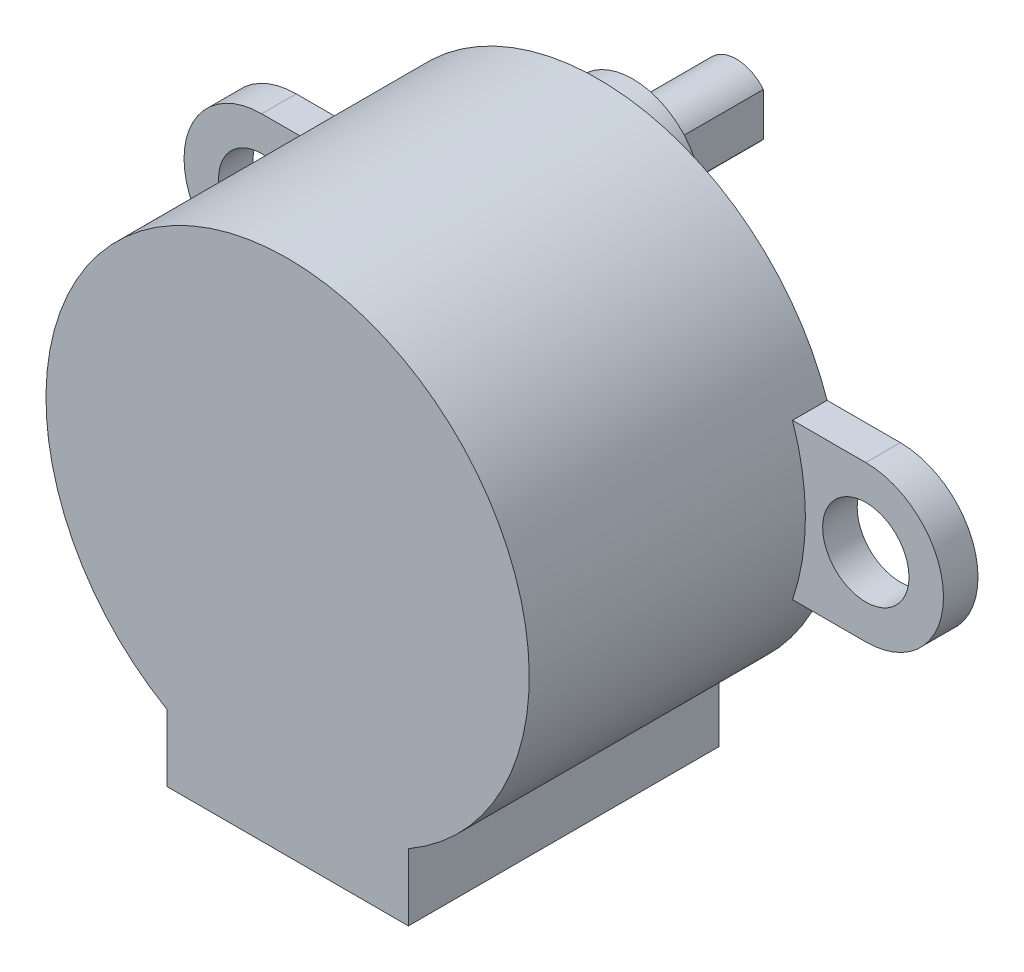
ISO-10303-21;
HEADER;
FILE_DESCRIPTION(('STEP AP214'),'2;1');
FILE_NAME('part.step','',(''),(''),'','','');
FILE_SCHEMA(('AUTOMOTIVE_DESIGN { 1 0 10303 214 1 1 1 1 }'));
ENDSEC;
DATA;
#1=APPLICATION_CONTEXT('core data for automotive mechanical design processes');
#2=APPLICATION_PROTOCOL_DEFINITION('international standard','automotive_design',2000,#1);
#3=PRODUCT_CONTEXT('',#1,'mechanical');
#4=PRODUCT('Part','Part','',(#3));
#5=PRODUCT_RELATED_PRODUCT_CATEGORY('part','',(#4));
#6=PRODUCT_DEFINITION_FORMATION('','',#4);
#7=PRODUCT_DEFINITION_CONTEXT('part definition',#1,'design');
#8=PRODUCT_DEFINITION('design','',#6,#7);
#9=PRODUCT_DEFINITION_SHAPE('','',#8);
#10=(LENGTH_UNIT() NAMED_UNIT(*) SI_UNIT(.MILLI.,.METRE.));
#11=(NAMED_UNIT(*) PLANE_ANGLE_UNIT() SI_UNIT($,.RADIAN.));
#12=(NAMED_UNIT(*) SI_UNIT($,.STERADIAN.) SOLID_ANGLE_UNIT());
#13=UNCERTAINTY_MEASURE_WITH_UNIT(LENGTH_MEASURE(1.E-05),#10,'distance_accuracy_value','');
#14=(GEOMETRIC_REPRESENTATION_CONTEXT(3) GLOBAL_UNCERTAINTY_ASSIGNED_CONTEXT((#13)) GLOBAL_UNIT_ASSIGNED_CONTEXT((#10,
#11,#12)) REPRESENTATION_CONTEXT('',''));
#15=CARTESIAN_POINT('',(0.,0.,0.));
#16=DIRECTION('',(0.,0.,1.));
#17=DIRECTION('',(1.,0.,0.));
#18=AXIS2_PLACEMENT_3D('',#15,#16,#17);
#19=CARTESIAN_POINT('',(0.,0.,-2.));
#20=DIRECTION('',(0.,0.,-1.));
#21=DIRECTION('',(-1.,0.,0.));
#22=AXIS2_PLACEMENT_3D('',#19,#20,#21);
#23=PLANE('',#22);
#24=CARTESIAN_POINT('',(0.,9.,-2.));
#25=DIRECTION('',(0.,0.,-1.));
#26=DIRECTION('',(-1.,0.,0.));
#27=AXIS2_PLACEMENT_3D('',#24,#25,#26);
#28=CIRCLE('',#27,4.);
#29=CARTESIAN_POINT('',(-4.,9.,-2.));
#30=VERTEX_POINT('',#29);
#31=EDGE_CURVE('E162',#30,#30,#28,.T.);
#32=ORIENTED_EDGE('',*,*,#31,.T.);
#33=EDGE_LOOP('',(#32));
#34=FACE_BOUND('',#33,.T.);
#35=CARTESIAN_POINT('',(0.,9.,-2.));
#36=DIRECTION('',(0.,0.,-1.));
#37=DIRECTION('',(-1.,0.,0.));
#38=AXIS2_PLACEMENT_3D('',#35,#36,#37);
#39=CIRCLE('',#38,2.);
#40=CARTESIAN_POINT('',(-1.5612494995996,10.25,-2.));
#41=VERTEX_POINT('',#40);
#42=CARTESIAN_POINT('',(1.5612494995996,10.25,-2.));
#43=VERTEX_POINT('',#42);
#44=EDGE_CURVE('E183',#41,#43,#39,.T.);
#45=ORIENTED_EDGE('',*,*,#44,.F.);
#46=DIRECTION('',(0.,-1.,0.));
#47=VECTOR('',#46,1.);
#48=CARTESIAN_POINT('',(-1.56124949959961,0.,-2.));
#49=LINE('',#48,#47);
#50=CARTESIAN_POINT('',(-1.5612494995996,7.75,-2.));
#51=VERTEX_POINT('',#50);
#52=EDGE_CURVE('E57',#41,#51,#49,.T.);
#53=ORIENTED_EDGE('',*,*,#52,.T.);
#54=CARTESIAN_POINT('',(1.5612494995996,7.75,-2.));
#55=VERTEX_POINT('',#54);
#56=EDGE_CURVE('E62',#55,#51,#39,.T.);
#57=ORIENTED_EDGE('',*,*,#56,.F.);
#58=DIRECTION('',(0.,-1.,0.));
#59=VECTOR('',#58,1.);
#60=CARTESIAN_POINT('',(1.5612494995996,0.,-2.));
#61=LINE('',#60,#59);
#62=EDGE_CURVE('E181',#43,#55,#61,.T.);
#63=ORIENTED_EDGE('',*,*,#62,.F.);
#64=EDGE_LOOP('',(#45,#53,#57,#63));
#65=FACE_BOUND('',#64,.T.);
#66=ADVANCED_FACE('F41',(#34,#65),#23,.T.);
#67=CARTESIAN_POINT('',(0.,0.,18.));
#68=DIRECTION('',(0.,0.,-1.));
#69=DIRECTION('',(-1.,0.,0.));
#70=AXIS2_PLACEMENT_3D('',#67,#68,#69);
#71=CYLINDRICAL_SURFACE('',#70,14.);
#72=CARTESIAN_POINT('',(0.,0.,0.));
#73=DIRECTION('',(0.,0.,1.));
#74=DIRECTION('',(1.,0.,0.));
#75=AXIS2_PLACEMENT_3D('',#72,#73,#74);
#76=CIRCLE('',#75,14.);
#77=CARTESIAN_POINT('',(13.2570735835629,4.5,0.));
#78=VERTEX_POINT('',#77);
#79=CARTESIAN_POINT('',(-13.2570735835629,4.5,0.));
#80=VERTEX_POINT('',#79);
#81=EDGE_CURVE('E332',#78,#80,#76,.T.);
#82=ORIENTED_EDGE('',*,*,#81,.T.);
#83=DIRECTION('',(0.,0.,-1.));
#84=VECTOR('',#83,1.);
#85=CARTESIAN_POINT('',(-13.2570735835629,4.5,2.));
#86=LINE('',#85,#84);
#87=CARTESIAN_POINT('',(-13.2570735835629,4.5,2.));
#88=VERTEX_POINT('',#87);
#89=EDGE_CURVE('E226',#88,#80,#86,.T.);
#90=ORIENTED_EDGE('',*,*,#89,.F.);
#91=CARTESIAN_POINT('',(0.,0.,2.));
#92=DIRECTION('',(0.,0.,-1.));
#93=DIRECTION('',(-1.,0.,0.));
#94=AXIS2_PLACEMENT_3D('',#91,#92,#93);
#95=CIRCLE('',#94,14.);
#96=CARTESIAN_POINT('',(-13.2570735835629,-4.5,2.));
#97=VERTEX_POINT('',#96);
#98=EDGE_CURVE('E214',#97,#88,#95,.T.);
#99=ORIENTED_EDGE('',*,*,#98,.F.);
#100=DIRECTION('',(0.,0.,-1.));
#101=VECTOR('',#100,1.);
#102=CARTESIAN_POINT('',(-13.2570735835629,-4.5,2.));
#103=LINE('',#102,#101);
#104=CARTESIAN_POINT('',(-13.2570735835629,-4.5,0.));
#105=VERTEX_POINT('',#104);
#106=EDGE_CURVE('E249',#97,#105,#103,.T.);
#107=ORIENTED_EDGE('',*,*,#106,.T.);
#108=CARTESIAN_POINT('',(-7.,-12.1243556529821,0.));
#109=VERTEX_POINT('',#108);
#110=EDGE_CURVE('E328',#105,#109,#76,.T.);
#111=ORIENTED_EDGE('',*,*,#110,.T.);
#112=DIRECTION('',(0.,0.,-1.));
#113=VECTOR('',#112,1.);
#114=CARTESIAN_POINT('',(-7.,-12.1243556529821,18.));
#115=LINE('',#114,#113);
#116=CARTESIAN_POINT('',(-7.,-12.1243556529821,18.));
#117=VERTEX_POINT('',#116);
#118=EDGE_CURVE('E338',#117,#109,#115,.T.);
#119=ORIENTED_EDGE('',*,*,#118,.F.);
#120=CARTESIAN_POINT('',(0.,0.,18.));
#121=DIRECTION('',(0.,0.,1.));
#122=DIRECTION('',(1.,0.,0.));
#123=AXIS2_PLACEMENT_3D('',#120,#121,#122);
#124=CIRCLE('',#123,14.);
#125=CARTESIAN_POINT('',(7.,-12.1243556529821,18.));
#126=VERTEX_POINT('',#125);
#127=EDGE_CURVE('E314',#126,#117,#124,.T.);
#128=ORIENTED_EDGE('',*,*,#127,.F.);
#129=DIRECTION('',(0.,0.,-1.));
#130=VECTOR('',#129,1.);
#131=CARTESIAN_POINT('',(7.,-12.1243556529821,18.));
#132=LINE('',#131,#130);
#133=CARTESIAN_POINT('',(7.,-12.1243556529821,0.));
#134=VERTEX_POINT('',#133);
#135=EDGE_CURVE('E342',#126,#134,#132,.T.);
#136=ORIENTED_EDGE('',*,*,#135,.T.);
#137=CARTESIAN_POINT('',(13.2570735835629,-4.5,0.));
#138=VERTEX_POINT('',#137);
#139=EDGE_CURVE('E329',#134,#138,#76,.T.);
#140=ORIENTED_EDGE('',*,*,#139,.T.);
#141=DIRECTION('',(0.,0.,-1.));
#142=VECTOR('',#141,1.);
#143=CARTESIAN_POINT('',(13.2570735835629,-4.5,2.));
#144=LINE('',#143,#142);
#145=CARTESIAN_POINT('',(13.2570735835629,-4.5,2.));
#146=VERTEX_POINT('',#145);
#147=EDGE_CURVE('E297',#146,#138,#144,.T.);
#148=ORIENTED_EDGE('',*,*,#147,.F.);
#149=CARTESIAN_POINT('',(0.,0.,2.));
#150=DIRECTION('',(0.,0.,-1.));
#151=DIRECTION('',(-1.,0.,0.));
#152=AXIS2_PLACEMENT_3D('',#149,#150,#151);
#153=CIRCLE('',#152,14.);
#154=CARTESIAN_POINT('',(13.2570735835629,4.5,2.));
#155=VERTEX_POINT('',#154);
#156=EDGE_CURVE('E273',#155,#146,#153,.T.);
#157=ORIENTED_EDGE('',*,*,#156,.F.);
#158=DIRECTION('',(0.,0.,-1.));
#159=VECTOR('',#158,1.);
#160=CARTESIAN_POINT('',(13.2570735835629,4.5,2.));
#161=LINE('',#160,#159);
#162=EDGE_CURVE('E292',#155,#78,#161,.T.);
#163=ORIENTED_EDGE('',*,*,#162,.T.);
#164=EDGE_LOOP('',(#82,#90,#99,#107,#111,#119,#128,#136,#140,#148,#157,#163));
#165=FACE_BOUND('',#164,.T.);
#166=ADVANCED_FACE('F367',(#165),#71,.T.);
#167=CARTESIAN_POINT('',(0.,-16.,18.));
#168=DIRECTION('',(0.,-1.,0.));
#169=DIRECTION('',(0.,0.,-1.));
#170=AXIS2_PLACEMENT_3D('',#167,#168,#169);
#171=PLANE('',#170);
#172=DIRECTION('',(-1.,0.,0.));
#173=VECTOR('',#172,1.);
#174=CARTESIAN_POINT('',(0.,-16.,0.));
#175=LINE('',#174,#173);
#176=CARTESIAN_POINT('',(7.,-16.,0.));
#177=VERTEX_POINT('',#176);
#178=CARTESIAN_POINT('',(-7.,-16.,0.));
#179=VERTEX_POINT('',#178);
#180=EDGE_CURVE('E296',#177,#179,#175,.T.);
#181=ORIENTED_EDGE('',*,*,#180,.F.);
#182=DIRECTION('',(0.,0.,-1.));
#183=VECTOR('',#182,1.);
#184=CARTESIAN_POINT('',(7.,-16.,18.));
#185=LINE('',#184,#183);
#186=CARTESIAN_POINT('',(7.,-16.,18.));
#187=VERTEX_POINT('',#186);
#188=EDGE_CURVE('E50',#187,#177,#185,.T.);
#189=ORIENTED_EDGE('',*,*,#188,.F.);
#190=DIRECTION('',(-1.,0.,0.));
#191=VECTOR('',#190,1.);
#192=CARTESIAN_POINT('',(0.,-16.,18.));
#193=LINE('',#192,#191);
#194=CARTESIAN_POINT('',(-7.,-16.,18.));
#195=VERTEX_POINT('',#194);
#196=EDGE_CURVE('E306',#187,#195,#193,.T.);
#197=ORIENTED_EDGE('',*,*,#196,.T.);
#198=DIRECTION('',(0.,0.,-1.));
#199=VECTOR('',#198,1.);
#200=CARTESIAN_POINT('',(-7.,-16.,18.));
#201=LINE('',#200,#199);
#202=EDGE_CURVE('E321',#195,#179,#201,.T.);
#203=ORIENTED_EDGE('',*,*,#202,.T.);
#204=EDGE_LOOP('',(#181,#189,#197,#203));
#205=FACE_BOUND('',#204,.T.);
#206=ADVANCED_FACE('F43',(#205),#171,.T.);
#207=CARTESIAN_POINT('',(7.,0.,18.));
#208=DIRECTION('',(-1.,0.,0.));
#209=DIRECTION('',(0.,0.,1.));
#210=AXIS2_PLACEMENT_3D('',#207,#208,#209);
#211=PLANE('',#210);
#212=DIRECTION('',(0.,1.,0.));
#213=VECTOR('',#212,1.);
#214=CARTESIAN_POINT('',(7.,0.,0.));
#215=LINE('',#214,#213);
#216=EDGE_CURVE('E325',#177,#134,#215,.T.);
#217=ORIENTED_EDGE('',*,*,#216,.T.);
#218=ORIENTED_EDGE('',*,*,#135,.F.);
#219=DIRECTION('',(0.,1.,0.));
#220=VECTOR('',#219,1.);
#221=CARTESIAN_POINT('',(7.,0.,18.));
#222=LINE('',#221,#220);
#223=EDGE_CURVE('E310',#187,#126,#222,.T.);
#224=ORIENTED_EDGE('',*,*,#223,.F.);
#225=ORIENTED_EDGE('',*,*,#188,.T.);
#226=EDGE_LOOP('',(#217,#218,#224,#225));
#227=FACE_BOUND('',#226,.T.);
#228=ADVANCED_FACE('F349',(#227),#211,.F.);
#229=CARTESIAN_POINT('',(-7.,0.,18.));
#230=DIRECTION('',(-1.,0.,0.));
#231=DIRECTION('',(0.,0.,1.));
#232=AXIS2_PLACEMENT_3D('',#229,#230,#231);
#233=PLANE('',#232);
#234=DIRECTION('',(0.,1.,0.));
#235=VECTOR('',#234,1.);
#236=CARTESIAN_POINT('',(-7.,0.,0.));
#237=LINE('',#236,#235);
#238=EDGE_CURVE('E311',#179,#109,#237,.T.);
#239=ORIENTED_EDGE('',*,*,#238,.F.);
#240=ORIENTED_EDGE('',*,*,#202,.F.);
#241=DIRECTION('',(0.,1.,0.));
#242=VECTOR('',#241,1.);
#243=CARTESIAN_POINT('',(-7.,0.,18.));
#244=LINE('',#243,#242);
#245=EDGE_CURVE('E317',#195,#117,#244,.T.);
#246=ORIENTED_EDGE('',*,*,#245,.T.);
#247=ORIENTED_EDGE('',*,*,#118,.T.);
#248=EDGE_LOOP('',(#239,#240,#246,#247));
#249=FACE_BOUND('',#248,.T.);
#250=ADVANCED_FACE('F361',(#249),#233,.T.);
#251=CARTESIAN_POINT('',(0.,0.,18.));
#252=DIRECTION('',(0.,0.,1.));
#253=DIRECTION('',(1.,0.,0.));
#254=AXIS2_PLACEMENT_3D('',#251,#252,#253);
#255=PLANE('',#254);
#256=ORIENTED_EDGE('',*,*,#196,.F.);
#257=ORIENTED_EDGE('',*,*,#223,.T.);
#258=ORIENTED_EDGE('',*,*,#127,.T.);
#259=ORIENTED_EDGE('',*,*,#245,.F.);
#260=EDGE_LOOP('',(#256,#257,#258,#259));
#261=FACE_BOUND('',#260,.T.);
#262=ADVANCED_FACE('F464',(#261),#255,.T.);
#263=CARTESIAN_POINT('',(0.,0.,0.));
#264=DIRECTION('',(0.,0.,1.));
#265=DIRECTION('',(1.,0.,0.));
#266=AXIS2_PLACEMENT_3D('',#263,#264,#265);
#267=PLANE('',#266);
#268=CARTESIAN_POINT('',(0.,9.,0.));
#269=DIRECTION('',(0.,0.,1.));
#270=DIRECTION('',(1.,0.,0.));
#271=AXIS2_PLACEMENT_3D('',#268,#269,#270);
#272=CIRCLE('',#271,4.);
#273=CARTESIAN_POINT('',(4.,9.,0.));
#274=VERTEX_POINT('',#273);
#275=EDGE_CURVE('E11',#274,#274,#272,.F.);
#276=ORIENTED_EDGE('',*,*,#275,.F.);
#277=EDGE_LOOP('',(#276));
#278=FACE_BOUND('',#277,.T.);
#279=ORIENTED_EDGE('',*,*,#180,.T.);
#280=ORIENTED_EDGE('',*,*,#238,.T.);
#281=ORIENTED_EDGE('',*,*,#110,.F.);
#282=DIRECTION('',(1.,0.,0.));
#283=VECTOR('',#282,1.);
#284=CARTESIAN_POINT('',(0.,-4.5,0.));
#285=LINE('',#284,#283);
#286=CARTESIAN_POINT('',(-17.5,-4.5,0.));
#287=VERTEX_POINT('',#286);
#288=EDGE_CURVE('E234',#287,#105,#285,.T.);
#289=ORIENTED_EDGE('',*,*,#288,.F.);
#290=CARTESIAN_POINT('',(-17.5,0.,0.));
#291=DIRECTION('',(0.,0.,-1.));
#292=DIRECTION('',(-1.,0.,0.));
#293=AXIS2_PLACEMENT_3D('',#290,#291,#292);
#294=CIRCLE('',#293,4.5);
#295=CARTESIAN_POINT('',(-17.5,4.5,0.));
#296=VERTEX_POINT('',#295);
#297=EDGE_CURVE('E210',#296,#287,#294,.F.);
#298=ORIENTED_EDGE('',*,*,#297,.F.);
#299=DIRECTION('',(1.,0.,0.));
#300=VECTOR('',#299,1.);
#301=CARTESIAN_POINT('',(0.,4.5,0.));
#302=LINE('',#301,#300);
#303=EDGE_CURVE('E230',#296,#80,#302,.T.);
#304=ORIENTED_EDGE('',*,*,#303,.T.);
#305=ORIENTED_EDGE('',*,*,#81,.F.);
#306=DIRECTION('',(-1.,0.,0.));
#307=VECTOR('',#306,1.);
#308=CARTESIAN_POINT('',(0.,4.5,0.));
#309=LINE('',#308,#307);
#310=CARTESIAN_POINT('',(17.5,4.5,0.));
#311=VERTEX_POINT('',#310);
#312=EDGE_CURVE('E281',#311,#78,#309,.T.);
#313=ORIENTED_EDGE('',*,*,#312,.F.);
#314=CARTESIAN_POINT('',(17.5,0.,0.));
#315=DIRECTION('',(0.,0.,-1.));
#316=DIRECTION('',(-1.,0.,0.));
#317=AXIS2_PLACEMENT_3D('',#314,#315,#316);
#318=CIRCLE('',#317,4.5);
#319=CARTESIAN_POINT('',(17.5,-4.5,0.));
#320=VERTEX_POINT('',#319);
#321=EDGE_CURVE('E285',#311,#320,#318,.T.);
#322=ORIENTED_EDGE('',*,*,#321,.T.);
#323=DIRECTION('',(-1.,0.,0.));
#324=VECTOR('',#323,1.);
#325=CARTESIAN_POINT('',(0.,-4.5,0.));
#326=LINE('',#325,#324);
#327=EDGE_CURVE('E261',#320,#138,#326,.T.);
#328=ORIENTED_EDGE('',*,*,#327,.T.);
#329=ORIENTED_EDGE('',*,*,#139,.F.);
#330=ORIENTED_EDGE('',*,*,#216,.F.);
#331=EDGE_LOOP('',(#279,#280,#281,#289,#298,#304,#305,#313,#322,#328,#329,#330));
#332=FACE_BOUND('',#331,.T.);
#333=CARTESIAN_POINT('',(17.5,0.,0.));
#334=DIRECTION('',(0.,0.,-1.));
#335=DIRECTION('',(-1.,0.,0.));
#336=AXIS2_PLACEMENT_3D('',#333,#334,#335);
#337=CIRCLE('',#336,2.5);
#338=CARTESIAN_POINT('',(15.,0.,0.));
#339=VERTEX_POINT('',#338);
#340=EDGE_CURVE('E244',#339,#339,#337,.T.);
#341=ORIENTED_EDGE('',*,*,#340,.F.);
#342=EDGE_LOOP('',(#341));
#343=FACE_BOUND('',#342,.T.);
#344=CARTESIAN_POINT('',(-17.5,0.,0.));
#345=DIRECTION('',(0.,0.,-1.));
#346=DIRECTION('',(-1.,0.,0.));
#347=AXIS2_PLACEMENT_3D('',#344,#345,#346);
#348=CIRCLE('',#347,2.5);
#349=CARTESIAN_POINT('',(-20.,0.,0.));
#350=VERTEX_POINT('',#349);
#351=EDGE_CURVE('E204',#350,#350,#348,.F.);
#352=ORIENTED_EDGE('',*,*,#351,.T.);
#353=EDGE_LOOP('',(#352));
#354=FACE_BOUND('',#353,.T.);
#355=ADVANCED_FACE('F356',(#278,#332,#343,#354),#267,.F.);
#356=CARTESIAN_POINT('',(0.,4.5,2.));
#357=DIRECTION('',(0.,-1.,0.));
#358=DIRECTION('',(0.,0.,-1.));
#359=AXIS2_PLACEMENT_3D('',#356,#357,#358);
#360=PLANE('',#359);
#361=ORIENTED_EDGE('',*,*,#312,.T.);
#362=ORIENTED_EDGE('',*,*,#162,.F.);
#363=DIRECTION('',(-1.,0.,0.));
#364=VECTOR('',#363,1.);
#365=CARTESIAN_POINT('',(0.,4.5,2.));
#366=LINE('',#365,#364);
#367=CARTESIAN_POINT('',(17.5,4.5,2.));
#368=VERTEX_POINT('',#367);
#369=EDGE_CURVE('E260',#368,#155,#366,.T.);
#370=ORIENTED_EDGE('',*,*,#369,.F.);
#371=DIRECTION('',(0.,0.,-1.));
#372=VECTOR('',#371,1.);
#373=CARTESIAN_POINT('',(17.5,4.5,2.));
#374=LINE('',#373,#372);
#375=EDGE_CURVE('E277',#368,#311,#374,.T.);
#376=ORIENTED_EDGE('',*,*,#375,.T.);
#377=EDGE_LOOP('',(#361,#362,#370,#376));
#378=FACE_BOUND('',#377,.T.);
#379=ADVANCED_FACE('F463',(#378),#360,.F.);
#380=CARTESIAN_POINT('',(0.,-4.5,2.));
#381=DIRECTION('',(0.,-1.,0.));
#382=DIRECTION('',(0.,0.,-1.));
#383=AXIS2_PLACEMENT_3D('',#380,#381,#382);
#384=PLANE('',#383);
#385=ORIENTED_EDGE('',*,*,#327,.F.);
#386=DIRECTION('',(0.,0.,-1.));
#387=VECTOR('',#386,1.);
#388=CARTESIAN_POINT('',(17.5,-4.5,2.));
#389=LINE('',#388,#387);
#390=CARTESIAN_POINT('',(17.5,-4.5,2.));
#391=VERTEX_POINT('',#390);
#392=EDGE_CURVE('E301',#391,#320,#389,.T.);
#393=ORIENTED_EDGE('',*,*,#392,.F.);
#394=DIRECTION('',(-1.,0.,0.));
#395=VECTOR('',#394,1.);
#396=CARTESIAN_POINT('',(0.,-4.5,2.));
#397=LINE('',#396,#395);
#398=EDGE_CURVE('E269',#391,#146,#397,.T.);
#399=ORIENTED_EDGE('',*,*,#398,.T.);
#400=ORIENTED_EDGE('',*,*,#147,.T.);
#401=EDGE_LOOP('',(#385,#393,#399,#400));
#402=FACE_BOUND('',#401,.T.);
#403=ADVANCED_FACE('F532',(#402),#384,.T.);
#404=CARTESIAN_POINT('',(17.5,0.,2.));
#405=DIRECTION('',(0.,0.,-1.));
#406=DIRECTION('',(-1.,0.,0.));
#407=AXIS2_PLACEMENT_3D('',#404,#405,#406);
#408=CYLINDRICAL_SURFACE('',#407,2.5);
#409=CARTESIAN_POINT('',(17.5,0.,2.));
#410=DIRECTION('',(0.,0.,-1.));
#411=DIRECTION('',(-1.,0.,0.));
#412=AXIS2_PLACEMENT_3D('',#409,#410,#411);
#413=CIRCLE('',#412,2.5);
#414=CARTESIAN_POINT('',(15.,0.,2.));
#415=VERTEX_POINT('',#414);
#416=EDGE_CURVE('E256',#415,#415,#413,.T.);
#417=ORIENTED_EDGE('',*,*,#416,.F.);
#418=EDGE_LOOP('',(#417));
#419=FACE_BOUND('',#418,.T.);
#420=ORIENTED_EDGE('',*,*,#340,.T.);
#421=EDGE_LOOP('',(#420));
#422=FACE_BOUND('',#421,.T.);
#423=ADVANCED_FACE('F522',(#419,#422),#408,.F.);
#424=CARTESIAN_POINT('',(17.5,0.,2.));
#425=DIRECTION('',(0.,0.,-1.));
#426=DIRECTION('',(-1.,0.,0.));
#427=AXIS2_PLACEMENT_3D('',#424,#425,#426);
#428=CYLINDRICAL_SURFACE('',#427,4.5);
#429=ORIENTED_EDGE('',*,*,#321,.F.);
#430=ORIENTED_EDGE('',*,*,#375,.F.);
#431=CARTESIAN_POINT('',(17.5,0.,2.));
#432=DIRECTION('',(0.,0.,-1.));
#433=DIRECTION('',(-1.,0.,0.));
#434=AXIS2_PLACEMENT_3D('',#431,#432,#433);
#435=CIRCLE('',#434,4.5);
#436=EDGE_CURVE('E265',#368,#391,#435,.T.);
#437=ORIENTED_EDGE('',*,*,#436,.T.);
#438=ORIENTED_EDGE('',*,*,#392,.T.);
#439=EDGE_LOOP('',(#429,#430,#437,#438));
#440=FACE_BOUND('',#439,.T.);
#441=ADVANCED_FACE('F512',(#440),#428,.T.);
#442=CARTESIAN_POINT('',(0.,0.,2.));
#443=DIRECTION('',(0.,0.,-1.));
#444=DIRECTION('',(-1.,0.,0.));
#445=AXIS2_PLACEMENT_3D('',#442,#443,#444);
#446=PLANE('',#445);
#447=ORIENTED_EDGE('',*,*,#416,.T.);
#448=EDGE_LOOP('',(#447));
#449=FACE_BOUND('',#448,.T.);
#450=ORIENTED_EDGE('',*,*,#369,.T.);
#451=ORIENTED_EDGE('',*,*,#156,.T.);
#452=ORIENTED_EDGE('',*,*,#398,.F.);
#453=ORIENTED_EDGE('',*,*,#436,.F.);
#454=EDGE_LOOP('',(#450,#451,#452,#453));
#455=FACE_BOUND('',#454,.T.);
#456=ADVANCED_FACE('F503',(#449,#455),#446,.F.);
#457=CARTESIAN_POINT('',(0.,4.5,2.));
#458=DIRECTION('',(0.,1.,0.));
#459=DIRECTION('',(0.,0.,1.));
#460=AXIS2_PLACEMENT_3D('',#457,#458,#459);
#461=PLANE('',#460);
#462=ORIENTED_EDGE('',*,*,#303,.F.);
#463=DIRECTION('',(0.,0.,-1.));
#464=VECTOR('',#463,1.);
#465=CARTESIAN_POINT('',(-17.5,4.5,2.));
#466=LINE('',#465,#464);
#467=CARTESIAN_POINT('',(-17.5,4.5,2.));
#468=VERTEX_POINT('',#467);
#469=EDGE_CURVE('E241',#468,#296,#466,.T.);
#470=ORIENTED_EDGE('',*,*,#469,.F.);
#471=DIRECTION('',(1.,0.,0.));
#472=VECTOR('',#471,1.);
#473=CARTESIAN_POINT('',(0.,4.5,2.));
#474=LINE('',#473,#472);
#475=EDGE_CURVE('E209',#468,#88,#474,.T.);
#476=ORIENTED_EDGE('',*,*,#475,.T.);
#477=ORIENTED_EDGE('',*,*,#89,.T.);
#478=EDGE_LOOP('',(#462,#470,#476,#477));
#479=FACE_BOUND('',#478,.T.);
#480=ADVANCED_FACE('F376',(#479),#461,.T.);
#481=CARTESIAN_POINT('',(-17.5,0.,2.));
#482=DIRECTION('',(0.,0.,-1.));
#483=DIRECTION('',(-1.,0.,0.));
#484=AXIS2_PLACEMENT_3D('',#481,#482,#483);
#485=CYLINDRICAL_SURFACE('',#484,4.5);
#486=ORIENTED_EDGE('',*,*,#297,.T.);
#487=DIRECTION('',(0.,0.,-1.));
#488=VECTOR('',#487,1.);
#489=CARTESIAN_POINT('',(-17.5,-4.5,2.));
#490=LINE('',#489,#488);
#491=CARTESIAN_POINT('',(-17.5,-4.5,2.));
#492=VERTEX_POINT('',#491);
#493=EDGE_CURVE('E245',#492,#287,#490,.T.);
#494=ORIENTED_EDGE('',*,*,#493,.F.);
#495=CARTESIAN_POINT('',(-17.5,0.,2.));
#496=DIRECTION('',(0.,0.,-1.));
#497=DIRECTION('',(-1.,0.,0.));
#498=AXIS2_PLACEMENT_3D('',#495,#496,#497);
#499=CIRCLE('',#498,4.5);
#500=EDGE_CURVE('E222',#468,#492,#499,.F.);
#501=ORIENTED_EDGE('',*,*,#500,.F.);
#502=ORIENTED_EDGE('',*,*,#469,.T.);
#503=EDGE_LOOP('',(#486,#494,#501,#502));
#504=FACE_BOUND('',#503,.T.);
#505=ADVANCED_FACE('F373',(#504),#485,.T.);
#506=CARTESIAN_POINT('',(0.,-4.5,2.));
#507=DIRECTION('',(0.,1.,0.));
#508=DIRECTION('',(0.,0.,1.));
#509=AXIS2_PLACEMENT_3D('',#506,#507,#508);
#510=PLANE('',#509);
#511=ORIENTED_EDGE('',*,*,#288,.T.);
#512=ORIENTED_EDGE('',*,*,#106,.F.);
#513=DIRECTION('',(1.,0.,0.));
#514=VECTOR('',#513,1.);
#515=CARTESIAN_POINT('',(0.,-4.5,2.));
#516=LINE('',#515,#514);
#517=EDGE_CURVE('E218',#492,#97,#516,.T.);
#518=ORIENTED_EDGE('',*,*,#517,.F.);
#519=ORIENTED_EDGE('',*,*,#493,.T.);
#520=EDGE_LOOP('',(#511,#512,#518,#519));
#521=FACE_BOUND('',#520,.T.);
#522=ADVANCED_FACE('F369',(#521),#510,.F.);
#523=CARTESIAN_POINT('',(-17.5,0.,2.));
#524=DIRECTION('',(0.,0.,-1.));
#525=DIRECTION('',(-1.,0.,0.));
#526=AXIS2_PLACEMENT_3D('',#523,#524,#525);
#527=CYLINDRICAL_SURFACE('',#526,2.5);
#528=CARTESIAN_POINT('',(-17.5,0.,2.));
#529=DIRECTION('',(0.,0.,-1.));
#530=DIRECTION('',(-1.,0.,0.));
#531=AXIS2_PLACEMENT_3D('',#528,#529,#530);
#532=CIRCLE('',#531,2.5);
#533=CARTESIAN_POINT('',(-20.,0.,2.));
#534=VERTEX_POINT('',#533);
#535=EDGE_CURVE('E205',#534,#534,#532,.F.);
#536=ORIENTED_EDGE('',*,*,#535,.T.);
#537=EDGE_LOOP('',(#536));
#538=FACE_BOUND('',#537,.T.);
#539=ORIENTED_EDGE('',*,*,#351,.F.);
#540=EDGE_LOOP('',(#539));
#541=FACE_BOUND('',#540,.T.);
#542=ADVANCED_FACE('F382',(#538,#541),#527,.F.);
#543=CARTESIAN_POINT('',(0.,0.,2.));
#544=DIRECTION('',(0.,0.,-1.));
#545=DIRECTION('',(-1.,0.,0.));
#546=AXIS2_PLACEMENT_3D('',#543,#544,#545);
#547=PLANE('',#546);
#548=ORIENTED_EDGE('',*,*,#535,.F.);
#549=EDGE_LOOP('',(#548));
#550=FACE_BOUND('',#549,.T.);
#551=ORIENTED_EDGE('',*,*,#475,.F.);
#552=ORIENTED_EDGE('',*,*,#500,.T.);
#553=ORIENTED_EDGE('',*,*,#517,.T.);
#554=ORIENTED_EDGE('',*,*,#98,.T.);
#555=EDGE_LOOP('',(#551,#552,#553,#554));
#556=FACE_BOUND('',#555,.T.);
#557=ADVANCED_FACE('F379',(#550,#556),#547,.F.);
#558=CARTESIAN_POINT('',(0.,9.,-2.));
#559=DIRECTION('',(0.,0.,1.));
#560=DIRECTION('',(1.,0.,0.));
#561=AXIS2_PLACEMENT_3D('',#558,#559,#560);
#562=CYLINDRICAL_SURFACE('',#561,4.);
#563=ORIENTED_EDGE('',*,*,#31,.F.);
#564=EDGE_LOOP('',(#563));
#565=FACE_BOUND('',#564,.T.);
#566=ORIENTED_EDGE('',*,*,#275,.T.);
#567=EDGE_LOOP('',(#566));
#568=FACE_BOUND('',#567,.T.);
#569=ADVANCED_FACE('F381',(#565,#568),#562,.T.);
#570=CARTESIAN_POINT('',(-1.56124949959961,0.,-8.));
#571=DIRECTION('',(-1.,0.,0.));
#572=DIRECTION('',(0.,-1.,0.));
#573=AXIS2_PLACEMENT_3D('',#570,#571,#572);
#574=PLANE('',#573);
#575=ORIENTED_EDGE('',*,*,#52,.F.);
#576=DIRECTION('',(0.,0.,1.));
#577=VECTOR('',#576,1.);
#578=CARTESIAN_POINT('',(-1.5612494995996,10.25,-8.));
#579=LINE('',#578,#577);
#580=CARTESIAN_POINT('',(-1.5612494995996,10.25,-8.));
#581=VERTEX_POINT('',#580);
#582=EDGE_CURVE('E154',#581,#41,#579,.T.);
#583=ORIENTED_EDGE('',*,*,#582,.F.);
#584=DIRECTION('',(0.,-1.,0.));
#585=VECTOR('',#584,1.);
#586=CARTESIAN_POINT('',(-1.56124949959961,0.,-8.));
#587=LINE('',#586,#585);
#588=CARTESIAN_POINT('',(-1.5612494995996,7.75,-8.));
#589=VERTEX_POINT('',#588);
#590=EDGE_CURVE('E158',#581,#589,#587,.T.);
#591=ORIENTED_EDGE('',*,*,#590,.T.);
#592=DIRECTION('',(0.,0.,1.));
#593=VECTOR('',#592,1.);
#594=CARTESIAN_POINT('',(-1.5612494995996,7.75,-8.));
#595=LINE('',#594,#593);
#596=EDGE_CURVE('E192',#589,#51,#595,.T.);
#597=ORIENTED_EDGE('',*,*,#596,.T.);
#598=EDGE_LOOP('',(#575,#583,#591,#597));
#599=FACE_BOUND('',#598,.T.);
#600=ADVANCED_FACE('F156',(#599),#574,.T.);
#601=CARTESIAN_POINT('',(0.,9.,-8.));
#602=DIRECTION('',(0.,0.,1.));
#603=DIRECTION('',(1.,0.,0.));
#604=AXIS2_PLACEMENT_3D('',#601,#602,#603);
#605=CYLINDRICAL_SURFACE('',#604,2.);
#606=ORIENTED_EDGE('',*,*,#44,.T.);
#607=DIRECTION('',(0.,0.,1.));
#608=VECTOR('',#607,1.);
#609=CARTESIAN_POINT('',(1.5612494995996,10.25,-8.));
#610=LINE('',#609,#608);
#611=CARTESIAN_POINT('',(1.5612494995996,10.25,-8.));
#612=VERTEX_POINT('',#611);
#613=EDGE_CURVE('E163',#612,#43,#610,.T.);
#614=ORIENTED_EDGE('',*,*,#613,.F.);
#615=CARTESIAN_POINT('',(0.,9.,-8.));
#616=DIRECTION('',(0.,0.,-1.));
#617=DIRECTION('',(-1.,0.,0.));
#618=AXIS2_PLACEMENT_3D('',#615,#616,#617);
#619=CIRCLE('',#618,2.);
#620=EDGE_CURVE('E166',#581,#612,#619,.T.);
#621=ORIENTED_EDGE('',*,*,#620,.F.);
#622=ORIENTED_EDGE('',*,*,#582,.T.);
#623=EDGE_LOOP('',(#606,#614,#621,#622));
#624=FACE_BOUND('',#623,.T.);
#625=ADVANCED_FACE('F167',(#624),#605,.T.);
#626=CARTESIAN_POINT('',(1.5612494995996,0.,-8.));
#627=DIRECTION('',(-1.,0.,0.));
#628=DIRECTION('',(0.,0.,1.));
#629=AXIS2_PLACEMENT_3D('',#626,#627,#628);
#630=PLANE('',#629);
#631=ORIENTED_EDGE('',*,*,#62,.T.);
#632=DIRECTION('',(0.,0.,1.));
#633=VECTOR('',#632,1.);
#634=CARTESIAN_POINT('',(1.5612494995996,7.75,-8.));
#635=LINE('',#634,#633);
#636=CARTESIAN_POINT('',(1.5612494995996,7.75,-8.));
#637=VERTEX_POINT('',#636);
#638=EDGE_CURVE('E195',#637,#55,#635,.T.);
#639=ORIENTED_EDGE('',*,*,#638,.F.);
#640=DIRECTION('',(0.,-1.,0.));
#641=VECTOR('',#640,1.);
#642=CARTESIAN_POINT('',(1.5612494995996,0.,-8.));
#643=LINE('',#642,#641);
#644=EDGE_CURVE('E172',#612,#637,#643,.T.);
#645=ORIENTED_EDGE('',*,*,#644,.F.);
#646=ORIENTED_EDGE('',*,*,#613,.T.);
#647=EDGE_LOOP('',(#631,#639,#645,#646));
#648=FACE_BOUND('',#647,.T.);
#649=ADVANCED_FACE('F405',(#648),#630,.F.);
#650=ORIENTED_EDGE('',*,*,#56,.T.);
#651=ORIENTED_EDGE('',*,*,#596,.F.);
#652=EDGE_CURVE('E174',#637,#589,#619,.T.);
#653=ORIENTED_EDGE('',*,*,#652,.F.);
#654=ORIENTED_EDGE('',*,*,#638,.T.);
#655=EDGE_LOOP('',(#650,#651,#653,#654));
#656=FACE_BOUND('',#655,.T.);
#657=ADVANCED_FACE('F408',(#656),#605,.T.);
#658=CARTESIAN_POINT('',(0.,0.,-8.));
#659=DIRECTION('',(0.,0.,-1.));
#660=DIRECTION('',(-1.,0.,0.));
#661=AXIS2_PLACEMENT_3D('',#658,#659,#660);
#662=PLANE('',#661);
#663=ORIENTED_EDGE('',*,*,#590,.F.);
#664=ORIENTED_EDGE('',*,*,#620,.T.);
#665=ORIENTED_EDGE('',*,*,#644,.T.);
#666=ORIENTED_EDGE('',*,*,#652,.T.);
#667=EDGE_LOOP('',(#663,#664,#665,#666));
#668=FACE_BOUND('',#667,.T.);
#669=ADVANCED_FACE('F175',(#668),#662,.T.);
#670=CLOSED_SHELL('',(#66,#166,#206,#228,#250,#262,#355,#379,#403,#423,#441,#456,#480,#505,#522,
#542,#557,#569,#600,#625,#649,#657,#669));
#671=MANIFOLD_SOLID_BREP('B2',#670);
#672=ADVANCED_BREP_SHAPE_REPRESENTATION('',(#18,#671),#14);
#673=SHAPE_DEFINITION_REPRESENTATION(#9,#672);
ENDSEC;
END-ISO-10303-21;
